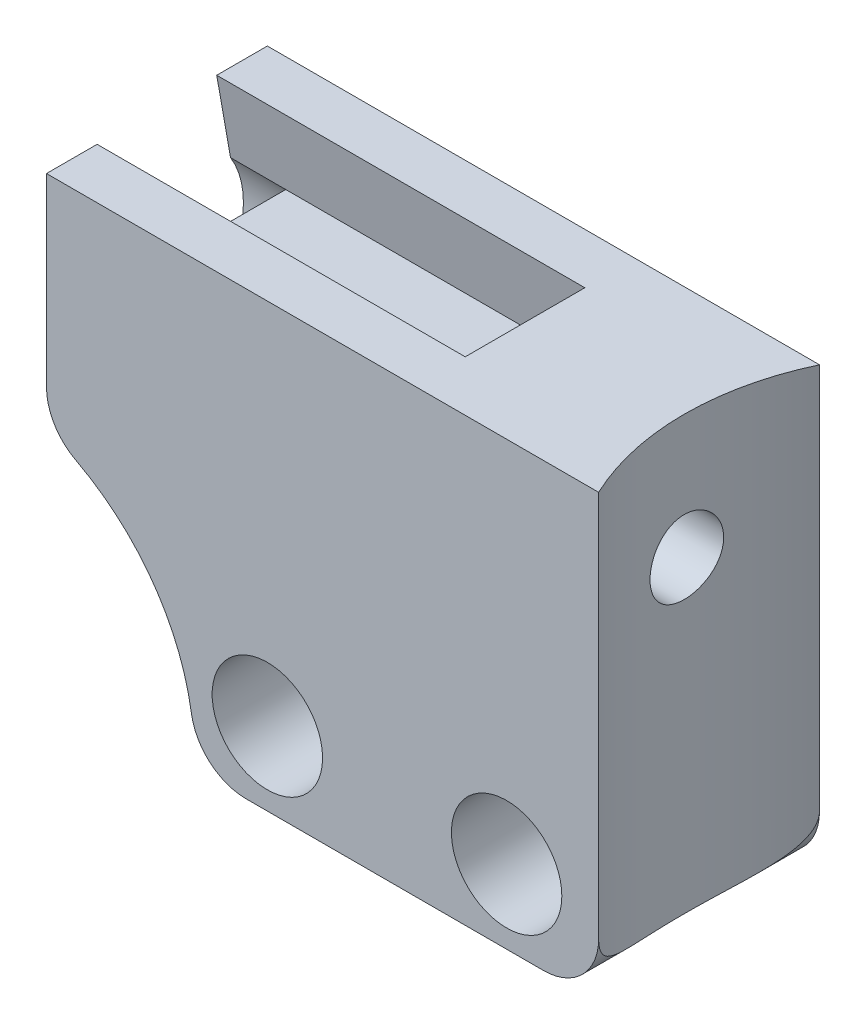
ISO-10303-21;
HEADER;
FILE_DESCRIPTION(('STEP AP214'),'2;1');
FILE_NAME('part.step','',(''),(''),'','','');
FILE_SCHEMA(('AUTOMOTIVE_DESIGN { 1 0 10303 214 1 1 1 1 }'));
ENDSEC;
DATA;
#1=APPLICATION_CONTEXT('core data for automotive mechanical design processes');
#2=APPLICATION_PROTOCOL_DEFINITION('international standard','automotive_design',2000,#1);
#3=PRODUCT_CONTEXT('',#1,'mechanical');
#4=PRODUCT('Part','Part','',(#3));
#5=PRODUCT_RELATED_PRODUCT_CATEGORY('part','',(#4));
#6=PRODUCT_DEFINITION_FORMATION('','',#4);
#7=PRODUCT_DEFINITION_CONTEXT('part definition',#1,'design');
#8=PRODUCT_DEFINITION('design','',#6,#7);
#9=PRODUCT_DEFINITION_SHAPE('','',#8);
#10=(LENGTH_UNIT() NAMED_UNIT(*) SI_UNIT(.MILLI.,.METRE.));
#11=(NAMED_UNIT(*) PLANE_ANGLE_UNIT() SI_UNIT($,.RADIAN.));
#12=(NAMED_UNIT(*) SI_UNIT($,.STERADIAN.) SOLID_ANGLE_UNIT());
#13=UNCERTAINTY_MEASURE_WITH_UNIT(LENGTH_MEASURE(1.E-05),#10,'distance_accuracy_value','');
#14=(GEOMETRIC_REPRESENTATION_CONTEXT(3) GLOBAL_UNCERTAINTY_ASSIGNED_CONTEXT((#13)) GLOBAL_UNIT_ASSIGNED_CONTEXT((#10,
#11,#12)) REPRESENTATION_CONTEXT('',''));
#15=CARTESIAN_POINT('',(0.,0.,0.));
#16=DIRECTION('',(0.,0.,1.));
#17=DIRECTION('',(1.,0.,0.));
#18=AXIS2_PLACEMENT_3D('',#15,#16,#17);
#19=CARTESIAN_POINT('',(0.,17.2787460994362,0.));
#20=DIRECTION('',(-1.,0.,0.));
#21=DIRECTION('',(0.,0.,1.));
#22=AXIS2_PLACEMENT_3D('',#19,#20,#21);
#23=CYLINDRICAL_SURFACE('',#22,2.);
#24=CARTESIAN_POINT('',(-27.,17.2787460994362,0.));
#25=DIRECTION('',(-1.,0.,0.));
#26=DIRECTION('',(0.,0.,1.));
#27=AXIS2_PLACEMENT_3D('',#24,#25,#26);
#28=CIRCLE('',#27,2.);
#29=CARTESIAN_POINT('',(-27.,17.2787460994362,2.));
#30=VERTEX_POINT('',#29);
#31=EDGE_CURVE('E231',#30,#30,#28,.T.);
#32=ORIENTED_EDGE('',*,*,#31,.T.);
#33=EDGE_LOOP('',(#32));
#34=FACE_BOUND('',#33,.T.);
#35=CARTESIAN_POINT('',(-1.2072958198775,17.2787460994362,2.));
#36=CARTESIAN_POINT('',(-1.20729761645299,17.3904702706759,1.99999534115949));
#37=CARTESIAN_POINT('',(-1.20866167905263,17.5022608122084,1.99060664506871));
#38=CARTESIAN_POINT('',(-1.21396735063322,17.7227207358595,1.95330740137887));
#39=CARTESIAN_POINT('',(-1.2179115281568,17.8313868949514,1.92537839621705));
#40=CARTESIAN_POINT('',(-1.22792178575887,18.0423747994651,1.85184738836467));
#41=CARTESIAN_POINT('',(-1.23398629440237,18.1447011775367,1.80625847122079));
#42=CARTESIAN_POINT('',(-1.24755202530755,18.3402358289043,1.69873175889211));
#43=CARTESIAN_POINT('',(-1.25505303527161,18.4334454464765,1.63679637900725));
#44=CARTESIAN_POINT('',(-1.270707611882,18.6087943952835,1.49785346840196));
#45=CARTESIAN_POINT('',(-1.27886510405378,18.6908578133021,1.42075056427329));
#46=CARTESIAN_POINT('',(-1.2948783905109,18.8409276566768,1.25386707896715));
#47=CARTESIAN_POINT('',(-1.30273416868212,18.9089333320765,1.16408582185113));
#48=CARTESIAN_POINT('',(-1.31729972955539,19.0292351971959,0.973910384020492));
#49=CARTESIAN_POINT('',(-1.32400438226122,19.0814618139546,0.873471766216092));
#50=CARTESIAN_POINT('',(-1.33546887385556,19.168276834764,0.665136745963096));
#51=CARTESIAN_POINT('',(-1.34022880616293,19.2028660860836,0.55724070203933));
#52=CARTESIAN_POINT('',(-1.34723985941628,19.2531953064005,0.337834063540951));
#53=CARTESIAN_POINT('',(-1.34950786250758,19.2690621694024,0.226353125069878));
#54=CARTESIAN_POINT('',(-1.35133731416478,19.2818899980028,0.00228956527839933));
#55=CARTESIAN_POINT('',(-1.3508988998488,19.2788519214023,-0.110292999940578));
#56=CARTESIAN_POINT('',(-1.34737845395911,19.2540567212204,-0.33249899218587));
#57=CARTESIAN_POINT('',(-1.34431570065077,19.2324361005537,-0.442137999771035));
#58=CARTESIAN_POINT('',(-1.33591221345283,19.171303539737,-0.656215595128694));
#59=CARTESIAN_POINT('',(-1.3305714254334,19.1317911744484,-0.760654059261884));
#60=CARTESIAN_POINT('',(-1.3181787630363,19.0358553546526,-0.961781966767738));
#61=CARTESIAN_POINT('',(-1.3111210410436,18.9793739483174,-1.05844339279107));
#62=CARTESIAN_POINT('',(-1.29608202628877,18.8511456066959,-1.24096782013765));
#63=CARTESIAN_POINT('',(-1.28810067832597,18.779397758793,-1.32683017541183));
#64=CARTESIAN_POINT('',(-1.27202140876451,18.6219114977602,-1.48612299106386));
#65=CARTESIAN_POINT('',(-1.26392308243878,18.536053966687,-1.55943569332184));
#66=CARTESIAN_POINT('',(-1.24859229808312,18.3531915780067,-1.69062989590123));
#67=CARTESIAN_POINT('',(-1.24135984448954,18.2561866632906,-1.74851131716179));
#68=CARTESIAN_POINT('',(-1.22857989615573,18.05366580953,-1.84721301520795));
#69=CARTESIAN_POINT('',(-1.22303351702515,17.9481442935536,-1.88802200251778));
#70=CARTESIAN_POINT('',(-1.21427401741597,17.7316485196103,-1.9513062370832));
#71=CARTESIAN_POINT('',(-1.21106074848775,17.6206746090446,-1.97378265080303));
#72=CARTESIAN_POINT('',(-1.20735916689967,17.3974695620062,-1.99960390688194));
#73=CARTESIAN_POINT('',(-1.20684713135755,17.2852580734406,-2.00311531104472));
#74=CARTESIAN_POINT('',(-1.20854308465363,17.061848294411,-1.99134808247121));
#75=CARTESIAN_POINT('',(-1.2107509971896,16.9506499756129,-1.9760699768337));
#76=CARTESIAN_POINT('',(-1.21761632457812,16.7329339194078,-1.92729837855202));
#77=CARTESIAN_POINT('',(-1.22226267277898,16.6263973723709,-1.89388715844421));
#78=CARTESIAN_POINT('',(-1.23347227144818,16.4204373019797,-1.80988306171463));
#79=CARTESIAN_POINT('',(-1.24003560842258,16.3210140998745,-1.75928940970141));
#80=CARTESIAN_POINT('',(-1.25439584346066,16.1313542197147,-1.64195360331226));
#81=CARTESIAN_POINT('',(-1.26220088384952,16.0411851382238,-1.57510320027125));
#82=CARTESIAN_POINT('',(-1.27814026798574,15.8732863758107,-1.42730277821365));
#83=CARTESIAN_POINT('',(-1.28627462855594,15.7955573313771,-1.34635203820217));
#84=CARTESIAN_POINT('',(-1.30202988346559,15.6541508810024,-1.17191708628535));
#85=CARTESIAN_POINT('',(-1.30964645494501,15.5905835771167,-1.07834317212433));
#86=CARTESIAN_POINT('',(-1.32344157492451,15.4800705363005,-0.881748704771195));
#87=CARTESIAN_POINT('',(-1.32962015973136,15.4331243796982,-0.778728390176455));
#88=CARTESIAN_POINT('',(-1.33982413777089,15.3573639851205,-0.566515924593931));
#89=CARTESIAN_POINT('',(-1.3438567958987,15.3284885108087,-0.457345999123928));
#90=CARTESIAN_POINT('',(-1.34934495049174,15.2894906323296,-0.235645259045785));
#91=CARTESIAN_POINT('',(-1.35080060067885,15.2793671095823,-0.123114645314278));
#92=CARTESIAN_POINT('',(-1.35096943604565,15.2781858604917,0.101043130627157));
#93=CARTESIAN_POINT('',(-1.34970690955043,15.2869592804178,0.212669421750584));
#94=CARTESIAN_POINT('',(-1.34463000207693,15.3229622494792,0.432842633479872));
#95=CARTESIAN_POINT('',(-1.34081562712352,15.3501917550401,0.541389561355443));
#96=CARTESIAN_POINT('',(-1.33106157986904,15.4222760768644,0.752283714497251));
#97=CARTESIAN_POINT('',(-1.32512318752313,15.4671202799209,0.854634630206984));
#98=CARTESIAN_POINT('',(-1.31177496034943,15.5731432486382,1.05038570585148));
#99=CARTESIAN_POINT('',(-1.30436508677029,15.6343224444943,1.14378562996655));
#100=CARTESIAN_POINT('',(-1.28881983396107,15.7718938146596,1.31984194960265));
#101=CARTESIAN_POINT('',(-1.28067881791678,15.8484110062687,1.40240016631985));
#102=CARTESIAN_POINT('',(-1.26463159358859,16.0142236596715,1.55356716727243));
#103=CARTESIAN_POINT('',(-1.25672544097715,16.1035221224327,1.6221726663073));
#104=CARTESIAN_POINT('',(-1.24200023784384,16.2928915377718,1.74379523475593));
#105=CARTESIAN_POINT('',(-1.23518689959913,16.3930147898473,1.79673154300995));
#106=CARTESIAN_POINT('',(-1.22348564068595,16.6007783960407,1.88495902507096));
#107=CARTESIAN_POINT('',(-1.21859569370808,16.7084106977534,1.92026877922144));
#108=CARTESIAN_POINT('',(-1.21244228150373,16.8935825252667,1.96409255165575));
#109=CARTESIAN_POINT('',(-1.21052239922045,16.9699704348468,1.97753762529532));
#110=CARTESIAN_POINT('',(-1.20794855248953,17.123810296402,1.99549291508544));
#111=CARTESIAN_POINT('',(-1.20729457390174,17.2012622364823,2.00000323103726));
#112=CARTESIAN_POINT('',(-1.2072958198775,17.2787460994362,2.));
#113=B_SPLINE_CURVE_WITH_KNOTS('',3,(#35,#36,#37,#38,#39,#40,#41,#42,#43,#44,#45,#46,#47,#48,
#49,#50,#51,#52,#53,#54,#55,#56,#57,#58,#59,#60,#61,#62,#63,#64,#65,#66,#67,#68,#69,#70,#71,#72,
#73,#74,#75,#76,#77,#78,#79,#80,#81,#82,#83,#84,#85,#86,#87,#88,#89,#90,#91,#92,#93,#94,#95,#96,
#97,#98,#99,#100,#101,#102,#103,#104,#105,#106,#107,#108,#109,#110,#111,#112),.UNSPECIFIED.,.T.,
.F.,(4,2,2,2,2,2,2,2,2,2,2,2,2,2,2,2,2,2,2,2,2,2,2,2,2,2,2,2,2,2,2,2,2,2,2,2,2,2,4),(0.,
0.334889349408971,0.670112594526281,1.00508792139358,1.34001378108308,1.6771171564902,
2.01423851114537,2.35282530676003,2.6913958357102,3.02765822138618,3.36390357078099,
3.69769984907442,4.03150405935711,4.36646147641387,4.70143892261039,5.03940517986243,
5.37737316862278,5.7155642933107,6.05373389790876,6.3889286108256,6.72411392079906,
7.05779100804298,7.39148315513125,7.72746121011463,8.06345644976601,8.40197921522166,
8.74049343261658,9.07785422138908,9.41519488547502,9.74953375304066,10.083871831239,
10.4180087723112,10.7521545140199,11.0891434930866,11.426211725383,11.7649881551453,
12.103406718889,12.3356645196522,12.5679197260806),.UNSPECIFIED.);
#114=CARTESIAN_POINT('',(-1.2072958198775,17.2787460994362,2.));
#115=VERTEX_POINT('',#114);
#116=EDGE_CURVE('E11',#115,#115,#113,.T.);
#117=ORIENTED_EDGE('',*,*,#116,.F.);
#118=EDGE_LOOP('',(#117));
#119=FACE_BOUND('',#118,.T.);
#120=ADVANCED_FACE('F39',(#34,#119),#23,.F.);
#121=CARTESIAN_POINT('',(-3.,3.,6.));
#122=DIRECTION('',(0.,0.,-1.));
#123=DIRECTION('',(-1.,0.,0.));
#124=AXIS2_PLACEMENT_3D('',#121,#122,#123);
#125=CYLINDRICAL_SURFACE('',#124,3.);
#126=CARTESIAN_POINT('',(0.,3.00000000000002,6.));
#127=CARTESIAN_POINT('',(4.32430555138922E-06,2.96131368489774,6.00000657782793));
#128=CARTESIAN_POINT('',(-0.000749031100675108,2.92264899494266,5.99842111634692));
#129=CARTESIAN_POINT('',(-0.0037260574453061,2.84565930508018,5.99214002263668));
#130=CARTESIAN_POINT('',(-0.00594859289457837,2.80733406598386,5.98744679231227));
#131=CARTESIAN_POINT('',(-0.0147008526854425,2.693914349222,5.96892549487739));
#132=CARTESIAN_POINT('',(-0.0233170042580858,2.61966237154087,5.95065279558791));
#133=CARTESIAN_POINT('',(-0.0452820682135443,2.47563715247697,5.90364706701084));
#134=CARTESIAN_POINT('',(-0.0586177805220394,2.40585205412109,5.87494320654241));
#135=CARTESIAN_POINT('',(-0.0890162554926041,2.27134310085746,5.80873973995464));
#136=CARTESIAN_POINT('',(-0.106087182101755,2.20663076086176,5.77122085363036));
#137=CARTESIAN_POINT('',(-0.154537743288445,2.04372826287639,5.66320698550602));
#138=CARTESIAN_POINT('',(-0.18815841559093,1.95011803825462,5.5868243336825));
#139=CARTESIAN_POINT('',(-0.259053506025177,1.77687848894329,5.42102147661569));
#140=CARTESIAN_POINT('',(-0.296337626344393,1.69728793804925,5.33156632801316));
#141=CARTESIAN_POINT('',(-0.366465210257066,1.56145571106221,5.15773522555035));
#142=CARTESIAN_POINT('',(-0.399138435334249,1.50350230201722,5.07460188449947));
#143=CARTESIAN_POINT('',(-0.464442005502469,1.39533757301824,4.90338040950719));
#144=CARTESIAN_POINT('',(-0.497072301168255,1.34513199696211,4.81528866502641));
#145=CARTESIAN_POINT('',(-0.561628899007836,1.25140415380009,4.63524768619274));
#146=CARTESIAN_POINT('',(-0.593554239616493,1.20789058404651,4.54329362635494));
#147=CARTESIAN_POINT('',(-0.656199869419031,1.12670848703533,4.35642562129567));
#148=CARTESIAN_POINT('',(-0.68691969647518,1.08904218530366,4.26151056551709));
#149=CARTESIAN_POINT('',(-0.775065294975482,0.985607331687847,3.9786527517509));
#150=CARTESIAN_POINT('',(-0.830333168952659,0.926866108740439,3.78745414397993));
#151=CARTESIAN_POINT('',(-0.933457830445835,0.824071261672477,3.39916477809136));
#152=CARTESIAN_POINT('',(-0.981307857275283,0.780030994459434,3.20206883798122));
#153=CARTESIAN_POINT('',(-1.06887907647508,0.703446368339828,2.80330945357193));
#154=CARTESIAN_POINT('',(-1.10857689216874,0.670934879975621,2.60163466634058));
#155=CARTESIAN_POINT('',(-1.17919548015236,0.615322865282577,2.1955472288429));
#156=CARTESIAN_POINT('',(-1.21011829250655,0.592220151002376,1.99113522653184));
#157=CARTESIAN_POINT('',(-1.25699210887975,0.55816628486571,1.62667082591958));
#158=CARTESIAN_POINT('',(-1.27474638167423,0.545650474506108,1.46698945687384));
#159=CARTESIAN_POINT('',(-1.30476508592709,0.524820318694511,1.14682323303154));
#160=CARTESIAN_POINT('',(-1.31702901807122,0.516506355366982,0.98633830649766));
#161=CARTESIAN_POINT('',(-1.3360237678297,0.503740202455899,0.664806153248079));
#162=CARTESIAN_POINT('',(-1.34275166479734,0.49929005123594,0.503758674680108));
#163=CARTESIAN_POINT('',(-1.35064171555358,0.494079079276011,0.181448324229977));
#164=CARTESIAN_POINT('',(-1.35180318143513,0.493318714524674,0.0201854281893537));
#165=CARTESIAN_POINT('',(-1.34855806845258,0.495455475463019,-0.301923523702598));
#166=CARTESIAN_POINT('',(-1.34416310815365,0.498344969236051,-0.462769746964203));
#167=CARTESIAN_POINT('',(-1.32984029761783,0.507884245524259,-0.78408471685415));
#168=CARTESIAN_POINT('',(-1.31991315912952,0.514533544319118,-0.944553509374802));
#169=CARTESIAN_POINT('',(-1.29456874264492,0.531854924065808,-1.26474525286659));
#170=CARTESIAN_POINT('',(-1.2791547362238,0.542524608062317,-1.42446859094746));
#171=CARTESIAN_POINT('',(-1.24289810046695,0.56831559402253,-1.74291960729583));
#172=CARTESIAN_POINT('',(-1.22205622253359,0.583436279853637,-1.9016474202657));
#173=CARTESIAN_POINT('',(-1.1760785316468,0.617963045019097,-2.21076212662484));
#174=CARTESIAN_POINT('',(-1.15117325373501,0.637150146141172,-2.36120756792393));
#175=CARTESIAN_POINT('',(-1.09661964349946,0.680869305178738,-2.66045578936483));
#176=CARTESIAN_POINT('',(-1.06697154747429,0.705401096830934,-2.80925865094928));
#177=CARTESIAN_POINT('',(-1.00311271873966,0.760752594701999,-3.10477985577465));
#178=CARTESIAN_POINT('',(-0.968900097953761,0.79157490575001,-3.25149730846452));
#179=CARTESIAN_POINT('',(-0.896220338278186,0.86069338747074,-3.54209281323172));
#180=CARTESIAN_POINT('',(-0.857754008451359,0.898988137928269,-3.68597139915252));
#181=CARTESIAN_POINT('',(-0.785746779046453,0.975350788889707,-3.93929073729185));
#182=CARTESIAN_POINT('',(-0.752935341083431,1.01168286609796,-4.04946041583884));
#183=CARTESIAN_POINT('',(-0.685326182564192,1.09081253821947,-4.2668180322021));
#184=CARTESIAN_POINT('',(-0.65052902549519,1.13360830455323,-4.37400680319485));
#185=CARTESIAN_POINT('',(-0.57951746805598,1.22667418526092,-4.58428594516791));
#186=CARTESIAN_POINT('',(-0.543306872324327,1.27692513356048,-4.68738599069193));
#187=CARTESIAN_POINT('',(-0.470132474833751,1.38627807038578,-4.88844373873728));
#188=CARTESIAN_POINT('',(-0.433169355593388,1.44537232242621,-4.98640583597532));
#189=CARTESIAN_POINT('',(-0.360586282056609,1.572175030529,-5.17276484627332));
#190=CARTESIAN_POINT('',(-0.324957931917135,1.63959217984807,-5.2613540633039));
#191=CARTESIAN_POINT('',(-0.255487094573217,1.78583525499626,-5.42951260634079));
#192=CARTESIAN_POINT('',(-0.221643860683014,1.86465635825711,-5.50908571988987));
#193=CARTESIAN_POINT('',(-0.162998639046298,2.02158741514103,-5.64397027703847));
#194=CARTESIAN_POINT('',(-0.13761123533588,2.09786831719648,-5.70112946958125));
#195=CARTESIAN_POINT('',(-0.0915959838611257,2.25958768213681,-5.80323466559771));
#196=CARTESIAN_POINT('',(-0.0709613843251925,2.34501289868122,-5.84819801067441));
#197=CARTESIAN_POINT('',(-0.0403961469725055,2.50421209121193,-5.91417327061582));
#198=CARTESIAN_POINT('',(-0.0291110335927961,2.57644116701487,-5.93827396964489));
#199=CARTESIAN_POINT('',(-0.0117769209315302,2.72428505877453,-5.97514464420929));
#200=CARTESIAN_POINT('',(-0.00571510232229286,2.79989110381275,-5.98794236215029));
#201=CARTESIAN_POINT('',(-0.00170866627508038,2.89665171887143,-5.99639650256274));
#202=CARTESIAN_POINT('',(-0.00106838999469525,2.91729951215707,-5.99774710398821));
#203=CARTESIAN_POINT('',(-0.000214560141068557,2.958628897362,-5.99954782677548));
#204=CARTESIAN_POINT('',(-7.13128067505531E-07,2.97931045623128,-5.99999856736084));
#205=CARTESIAN_POINT('',(0.,2.99999999999996,-6.00000000000067));
#206=B_SPLINE_CURVE_WITH_KNOTS('',3,(#126,#127,#128,#129,#130,#131,#132,#133,#134,#135,#136,
#137,#138,#139,#140,#141,#142,#143,#144,#145,#146,#147,#148,#149,#150,#151,#152,#153,#154,#155,
#156,#157,#158,#159,#160,#161,#162,#163,#164,#165,#166,#167,#168,#169,#170,#171,#172,#173,#174,
#175,#176,#177,#178,#179,#180,#181,#182,#183,#184,#185,#186,#187,#188,#189,#190,#191,#192,#193,
#194,#195,#196,#197,#198,#199,#200,#201,#202,#203,#204,#205),.UNSPECIFIED.,.F.,.F.,(4,2,2,2,2,2,
2,2,2,2,2,2,2,2,2,2,2,2,2,2,2,2,2,2,2,2,2,2,2,2,2,2,2,2,2,2,2,2,2,4),(0.,0.115978440825648,
0.23186734971932,0.461534914863905,0.690565137462779,0.920101036004706,1.29418067542735,
1.66927918438642,1.98825534975723,2.30746686542738,2.62708980488812,2.94683409918986,
3.5683430669535,4.19041519435523,4.81424696004488,5.4379335746249,5.9212438006754,
6.40459797202966,6.8882069833997,7.3718757582815,7.85453484564129,8.33713185028627,
8.81944158448488,9.30168458604014,9.76261043610152,10.2235133288779,10.6846074647029,
11.1456140499788,11.5070956943804,11.8684752664076,12.2289413919191,12.5890939907266,
12.9390483454712,13.2888551397755,13.583773698603,13.8782706798592,14.1082791886236,
14.3377215754368,14.3998110483178,14.4618577806615),.UNSPECIFIED.);
#207=CARTESIAN_POINT('',(0.,3.00000000000002,6.));
#208=VERTEX_POINT('',#207);
#209=CARTESIAN_POINT('',(0.,3.00000000000002,-6.00000000000001));
#210=VERTEX_POINT('',#209);
#211=EDGE_CURVE('E43',#208,#210,#206,.T.);
#212=ORIENTED_EDGE('',*,*,#211,.F.);
#213=CARTESIAN_POINT('',(-3.,3.,6.));
#214=DIRECTION('',(0.,0.,1.));
#215=DIRECTION('',(1.,0.,0.));
#216=AXIS2_PLACEMENT_3D('',#213,#214,#215);
#217=CIRCLE('',#216,3.);
#218=CARTESIAN_POINT('',(-3.00000000000002,0.,6.));
#219=VERTEX_POINT('',#218);
#220=EDGE_CURVE('E131',#219,#208,#217,.T.);
#221=ORIENTED_EDGE('',*,*,#220,.F.);
#222=DIRECTION('',(0.,0.,-1.));
#223=VECTOR('',#222,1.);
#224=CARTESIAN_POINT('',(-3.00000000000002,0.,6.));
#225=LINE('',#224,#223);
#226=CARTESIAN_POINT('',(-3.00000000000002,0.,-6.));
#227=VERTEX_POINT('',#226);
#228=EDGE_CURVE('E139',#219,#227,#225,.T.);
#229=ORIENTED_EDGE('',*,*,#228,.T.);
#230=CARTESIAN_POINT('',(-3.,3.,-6.));
#231=DIRECTION('',(0.,0.,1.));
#232=DIRECTION('',(1.,0.,0.));
#233=AXIS2_PLACEMENT_3D('',#230,#231,#232);
#234=CIRCLE('',#233,3.);
#235=EDGE_CURVE('E167',#227,#210,#234,.T.);
#236=ORIENTED_EDGE('',*,*,#235,.T.);
#237=EDGE_LOOP('',(#212,#221,#229,#236));
#238=FACE_BOUND('',#237,.T.);
#239=ADVANCED_FACE('F148',(#238),#125,.T.);
#240=CARTESIAN_POINT('',(-30.,24.,6.));
#241=DIRECTION('',(1.,0.,0.));
#242=DIRECTION('',(0.,0.,-1.));
#243=AXIS2_PLACEMENT_3D('',#240,#241,#242);
#244=PLANE('',#243);
#245=DIRECTION('',(0.,-0.984807753012208,0.173648177666934));
#246=VECTOR('',#245,1.);
#247=CARTESIAN_POINT('',(-30.,1.27947128347335,7.25624222868521));
#248=LINE('',#247,#246);
#249=CARTESIAN_POINT('',(-30.,24.,3.25));
#250=VERTEX_POINT('',#249);
#251=CARTESIAN_POINT('',(-30.,19.7465386352868,4.));
#252=VERTEX_POINT('',#251);
#253=EDGE_CURVE('E259',#250,#252,#248,.T.);
#254=ORIENTED_EDGE('',*,*,#253,.T.);
#255=CARTESIAN_POINT('',(-30.,17.2787460994362,0.));
#256=DIRECTION('',(-1.,0.,0.));
#257=DIRECTION('',(0.,0.,1.));
#258=AXIS2_PLACEMENT_3D('',#255,#256,#257);
#259=CIRCLE('',#258,4.7);
#260=CARTESIAN_POINT('',(-30.,13.9561431810345,3.32420063272788));
#261=VERTEX_POINT('',#260);
#262=EDGE_CURVE('E61',#261,#252,#259,.T.);
#263=ORIENTED_EDGE('',*,*,#262,.F.);
#264=DIRECTION('',(0.,0.,-1.));
#265=VECTOR('',#264,1.);
#266=CARTESIAN_POINT('',(-30.,13.9561431810345,6.));
#267=LINE('',#266,#265);
#268=CARTESIAN_POINT('',(-30.,13.9561431810345,6.));
#269=VERTEX_POINT('',#268);
#270=EDGE_CURVE('E181',#269,#261,#267,.T.);
#271=ORIENTED_EDGE('',*,*,#270,.F.);
#272=DIRECTION('',(0.,-1.,0.));
#273=VECTOR('',#272,1.);
#274=CARTESIAN_POINT('',(-30.,24.,6.));
#275=LINE('',#274,#273);
#276=CARTESIAN_POINT('',(-30.,24.,6.));
#277=VERTEX_POINT('',#276);
#278=EDGE_CURVE('E110',#277,#269,#275,.T.);
#279=ORIENTED_EDGE('',*,*,#278,.F.);
#280=DIRECTION('',(0.,0.,-1.));
#281=VECTOR('',#280,1.);
#282=CARTESIAN_POINT('',(-30.,24.,6.));
#283=LINE('',#282,#281);
#284=EDGE_CURVE('E184',#277,#250,#283,.T.);
#285=ORIENTED_EDGE('',*,*,#284,.T.);
#286=EDGE_LOOP('',(#254,#263,#271,#279,#285));
#287=FACE_BOUND('',#286,.T.);
#288=ADVANCED_FACE('F210',(#287),#244,.F.);
#289=CARTESIAN_POINT('',(-10.,19.7465386352868,0.));
#290=DIRECTION('',(0.,1.,0.));
#291=DIRECTION('',(0.,0.,1.));
#292=AXIS2_PLACEMENT_3D('',#289,#290,#291);
#293=PLANE('',#292);
#294=DIRECTION('',(-1.,0.,0.));
#295=VECTOR('',#294,1.);
#296=CARTESIAN_POINT('',(-10.,19.7465386352868,-4.));
#297=LINE('',#296,#295);
#298=CARTESIAN_POINT('',(-10.,19.7465386352868,-4.));
#299=VERTEX_POINT('',#298);
#300=CARTESIAN_POINT('',(-27.,19.7465386352868,-4.));
#301=VERTEX_POINT('',#300);
#302=EDGE_CURVE('E348',#299,#301,#297,.T.);
#303=ORIENTED_EDGE('',*,*,#302,.T.);
#304=DIRECTION('',(0.,0.,-1.));
#305=VECTOR('',#304,1.);
#306=CARTESIAN_POINT('',(-27.,19.7465386352868,0.));
#307=LINE('',#306,#305);
#308=CARTESIAN_POINT('',(-27.,19.7465386352868,4.));
#309=VERTEX_POINT('',#308);
#310=EDGE_CURVE('E325',#309,#301,#307,.T.);
#311=ORIENTED_EDGE('',*,*,#310,.F.);
#312=DIRECTION('',(-1.,0.,0.));
#313=VECTOR('',#312,1.);
#314=CARTESIAN_POINT('',(-10.,19.7465386352868,4.));
#315=LINE('',#314,#313);
#316=CARTESIAN_POINT('',(-10.,19.7465386352868,4.));
#317=VERTEX_POINT('',#316);
#318=EDGE_CURVE('E345',#317,#309,#315,.T.);
#319=ORIENTED_EDGE('',*,*,#318,.F.);
#320=DIRECTION('',(0.,0.,-1.));
#321=VECTOR('',#320,1.);
#322=CARTESIAN_POINT('',(-10.,19.7465386352868,0.));
#323=LINE('',#322,#321);
#324=EDGE_CURVE('E263',#317,#299,#323,.T.);
#325=ORIENTED_EDGE('',*,*,#324,.T.);
#326=EDGE_LOOP('',(#303,#311,#319,#325));
#327=FACE_BOUND('',#326,.T.);
#328=ADVANCED_FACE('F205',(#327),#293,.T.);
#329=CARTESIAN_POINT('',(0.,24.,6.));
#330=DIRECTION('',(0.,-1.,0.));
#331=DIRECTION('',(0.,0.,-1.));
#332=AXIS2_PLACEMENT_3D('',#329,#330,#331);
#333=PLANE('',#332);
#334=CARTESIAN_POINT('',(12.6491106406735,24.,0.));
#335=DIRECTION('',(0.,-1.,0.));
#336=DIRECTION('',(0.,0.,-1.));
#337=AXIS2_PLACEMENT_3D('',#334,#335,#336);
#338=CIRCLE('',#337,14.);
#339=CARTESIAN_POINT('',(0.,24.,-6.));
#340=VERTEX_POINT('',#339);
#341=CARTESIAN_POINT('',(0.,24.,6.));
#342=VERTEX_POINT('',#341);
#343=EDGE_CURVE('E101',#340,#342,#338,.F.);
#344=ORIENTED_EDGE('',*,*,#343,.F.);
#345=DIRECTION('',(-1.,0.,0.));
#346=VECTOR('',#345,1.);
#347=CARTESIAN_POINT('',(0.,24.,-6.));
#348=LINE('',#347,#346);
#349=CARTESIAN_POINT('',(-30.,24.,-6.));
#350=VERTEX_POINT('',#349);
#351=EDGE_CURVE('E154',#340,#350,#348,.T.);
#352=ORIENTED_EDGE('',*,*,#351,.T.);
#353=CARTESIAN_POINT('',(-30.,24.,-3.25));
#354=VERTEX_POINT('',#353);
#355=EDGE_CURVE('E183',#354,#350,#283,.T.);
#356=ORIENTED_EDGE('',*,*,#355,.F.);
#357=DIRECTION('',(-1.,0.,0.));
#358=VECTOR('',#357,1.);
#359=CARTESIAN_POINT('',(-10.,24.,-3.25));
#360=LINE('',#359,#358);
#361=CARTESIAN_POINT('',(-10.,24.,-3.25));
#362=VERTEX_POINT('',#361);
#363=EDGE_CURVE('E358',#362,#354,#360,.T.);
#364=ORIENTED_EDGE('',*,*,#363,.F.);
#365=DIRECTION('',(0.,0.,-1.));
#366=VECTOR('',#365,1.);
#367=CARTESIAN_POINT('',(-10.,24.,0.));
#368=LINE('',#367,#366);
#369=CARTESIAN_POINT('',(-10.,24.,3.25));
#370=VERTEX_POINT('',#369);
#371=EDGE_CURVE('E361',#370,#362,#368,.T.);
#372=ORIENTED_EDGE('',*,*,#371,.F.);
#373=DIRECTION('',(-1.,0.,0.));
#374=VECTOR('',#373,1.);
#375=CARTESIAN_POINT('',(-10.,24.,3.25));
#376=LINE('',#375,#374);
#377=EDGE_CURVE('E354',#370,#250,#376,.T.);
#378=ORIENTED_EDGE('',*,*,#377,.T.);
#379=ORIENTED_EDGE('',*,*,#284,.F.);
#380=DIRECTION('',(-1.,0.,0.));
#381=VECTOR('',#380,1.);
#382=CARTESIAN_POINT('',(0.,24.,6.));
#383=LINE('',#382,#381);
#384=EDGE_CURVE('E171',#342,#277,#383,.T.);
#385=ORIENTED_EDGE('',*,*,#384,.F.);
#386=EDGE_LOOP('',(#344,#352,#356,#364,#372,#378,#379,#385));
#387=FACE_BOUND('',#386,.T.);
#388=ADVANCED_FACE('F41',(#387),#333,.F.);
#389=CARTESIAN_POINT('',(-30.,13.9561431810345,-3.32420063272788));
#390=VERTEX_POINT('',#389);
#391=CARTESIAN_POINT('',(-30.,13.9561431810345,-6.));
#392=VERTEX_POINT('',#391);
#393=EDGE_CURVE('E180',#390,#392,#267,.T.);
#394=ORIENTED_EDGE('',*,*,#393,.F.);
#395=CARTESIAN_POINT('',(-30.,19.7465386352868,-4.));
#396=VERTEX_POINT('',#395);
#397=EDGE_CURVE('E321',#396,#390,#259,.T.);
#398=ORIENTED_EDGE('',*,*,#397,.F.);
#399=DIRECTION('',(0.,0.984807753012208,0.173648177666934));
#400=VECTOR('',#399,1.);
#401=CARTESIAN_POINT('',(-30.,1.27947128347335,-7.25624222868521));
#402=LINE('',#401,#400);
#403=EDGE_CURVE('E197',#396,#354,#402,.T.);
#404=ORIENTED_EDGE('',*,*,#403,.T.);
#405=ORIENTED_EDGE('',*,*,#355,.T.);
#406=DIRECTION('',(0.,-1.,0.));
#407=VECTOR('',#406,1.);
#408=CARTESIAN_POINT('',(-30.,24.,-6.));
#409=LINE('',#408,#407);
#410=EDGE_CURVE('E156',#350,#392,#409,.T.);
#411=ORIENTED_EDGE('',*,*,#410,.T.);
#412=EDGE_LOOP('',(#394,#398,#404,#405,#411));
#413=FACE_BOUND('',#412,.T.);
#414=ADVANCED_FACE('F193',(#413),#244,.F.);
#415=CARTESIAN_POINT('',(-27.,13.9561431810345,6.));
#416=DIRECTION('',(0.,0.,1.));
#417=DIRECTION('',(1.,0.,0.));
#418=AXIS2_PLACEMENT_3D('',#415,#416,#417);
#419=PLANE('',#418);
#420=CARTESIAN_POINT('',(-18.,4.,6.));
#421=DIRECTION('',(0.,0.,1.));
#422=DIRECTION('',(1.,0.,0.));
#423=AXIS2_PLACEMENT_3D('',#420,#421,#422);
#424=CIRCLE('',#423,3.);
#425=CARTESIAN_POINT('',(-15.,4.,6.));
#426=VERTEX_POINT('',#425);
#427=EDGE_CURVE('E157',#426,#426,#424,.T.);
#428=ORIENTED_EDGE('',*,*,#427,.F.);
#429=EDGE_LOOP('',(#428));
#430=FACE_BOUND('',#429,.T.);
#431=ORIENTED_EDGE('',*,*,#384,.T.);
#432=ORIENTED_EDGE('',*,*,#278,.T.);
#433=CARTESIAN_POINT('',(-27.,13.9561431810345,6.));
#434=DIRECTION('',(0.,0.,1.));
#435=DIRECTION('',(1.,0.,0.));
#436=AXIS2_PLACEMENT_3D('',#433,#434,#435);
#437=CIRCLE('',#436,3.);
#438=CARTESIAN_POINT('',(-28.3961492122268,11.3008150700097,6.));
#439=VERTEX_POINT('',#438);
#440=EDGE_CURVE('E309',#269,#439,#437,.T.);
#441=ORIENTED_EDGE('',*,*,#440,.T.);
#442=CARTESIAN_POINT('',(-33.9807460611341,0.67950262591059,6.));
#443=DIRECTION('',(0.,0.,-1.));
#444=DIRECTION('',(-1.,0.,0.));
#445=AXIS2_PLACEMENT_3D('',#442,#443,#444);
#446=CIRCLE('',#445,12.);
#447=CARTESIAN_POINT('',(-22.1252078262171,2.53590052518212,6.));
#448=VERTEX_POINT('',#447);
#449=EDGE_CURVE('E311',#439,#448,#446,.T.);
#450=ORIENTED_EDGE('',*,*,#449,.T.);
#451=CARTESIAN_POINT('',(-19.1613232674878,3.,6.));
#452=DIRECTION('',(0.,0.,1.));
#453=DIRECTION('',(-1.,0.,0.));
#454=AXIS2_PLACEMENT_3D('',#451,#452,#453);
#455=CIRCLE('',#454,3.);
#456=CARTESIAN_POINT('',(-19.1613232674878,0.,6.));
#457=VERTEX_POINT('',#456);
#458=EDGE_CURVE('E133',#448,#457,#455,.T.);
#459=ORIENTED_EDGE('',*,*,#458,.T.);
#460=DIRECTION('',(1.,0.,0.));
#461=VECTOR('',#460,1.);
#462=CARTESIAN_POINT('',(-19.1613232674878,0.,6.));
#463=LINE('',#462,#461);
#464=EDGE_CURVE('E126',#457,#219,#463,.T.);
#465=ORIENTED_EDGE('',*,*,#464,.T.);
#466=ORIENTED_EDGE('',*,*,#220,.T.);
#467=DIRECTION('',(0.,1.,0.));
#468=VECTOR('',#467,1.);
#469=CARTESIAN_POINT('',(0.,3.00000000000002,6.));
#470=LINE('',#469,#468);
#471=EDGE_CURVE('E70',#208,#342,#470,.T.);
#472=ORIENTED_EDGE('',*,*,#471,.T.);
#473=EDGE_LOOP('',(#431,#432,#441,#450,#459,#465,#466,#472));
#474=FACE_BOUND('',#473,.T.);
#475=CARTESIAN_POINT('',(-5.,4.,6.));
#476=DIRECTION('',(0.,0.,1.));
#477=DIRECTION('',(1.,0.,0.));
#478=AXIS2_PLACEMENT_3D('',#475,#476,#477);
#479=CIRCLE('',#478,3.);
#480=CARTESIAN_POINT('',(-2.,4.,6.));
#481=VERTEX_POINT('',#480);
#482=EDGE_CURVE('E299',#481,#481,#479,.T.);
#483=ORIENTED_EDGE('',*,*,#482,.F.);
#484=EDGE_LOOP('',(#483));
#485=FACE_BOUND('',#484,.T.);
#486=ADVANCED_FACE('F128',(#430,#474,#485),#419,.T.);
#487=CARTESIAN_POINT('',(-27.,13.9561431810345,-6.));
#488=DIRECTION('',(0.,0.,1.));
#489=DIRECTION('',(1.,0.,0.));
#490=AXIS2_PLACEMENT_3D('',#487,#488,#489);
#491=PLANE('',#490);
#492=ORIENTED_EDGE('',*,*,#351,.F.);
#493=DIRECTION('',(0.,1.,0.));
#494=VECTOR('',#493,1.);
#495=CARTESIAN_POINT('',(0.,3.00000000000002,-6.));
#496=LINE('',#495,#494);
#497=EDGE_CURVE('E169',#210,#340,#496,.T.);
#498=ORIENTED_EDGE('',*,*,#497,.F.);
#499=ORIENTED_EDGE('',*,*,#235,.F.);
#500=DIRECTION('',(1.,0.,0.));
#501=VECTOR('',#500,1.);
#502=CARTESIAN_POINT('',(-19.1613232674878,0.,-6.));
#503=LINE('',#502,#501);
#504=CARTESIAN_POINT('',(-19.1613232674878,0.,-6.));
#505=VERTEX_POINT('',#504);
#506=EDGE_CURVE('E142',#505,#227,#503,.T.);
#507=ORIENTED_EDGE('',*,*,#506,.F.);
#508=CARTESIAN_POINT('',(-19.1613232674878,3.,-6.));
#509=DIRECTION('',(0.,0.,1.));
#510=DIRECTION('',(-1.,0.,0.));
#511=AXIS2_PLACEMENT_3D('',#508,#509,#510);
#512=CIRCLE('',#511,3.);
#513=CARTESIAN_POINT('',(-22.1252078262171,2.53590052518212,-6.));
#514=VERTEX_POINT('',#513);
#515=EDGE_CURVE('E164',#514,#505,#512,.T.);
#516=ORIENTED_EDGE('',*,*,#515,.F.);
#517=CARTESIAN_POINT('',(-33.9807460611341,0.67950262591059,-6.));
#518=DIRECTION('',(0.,0.,-1.));
#519=DIRECTION('',(-1.,0.,0.));
#520=AXIS2_PLACEMENT_3D('',#517,#518,#519);
#521=CIRCLE('',#520,12.);
#522=CARTESIAN_POINT('',(-28.3961492122268,11.3008150700097,-6.));
#523=VERTEX_POINT('',#522);
#524=EDGE_CURVE('E162',#523,#514,#521,.T.);
#525=ORIENTED_EDGE('',*,*,#524,.F.);
#526=CARTESIAN_POINT('',(-27.,13.9561431810345,-6.));
#527=DIRECTION('',(0.,0.,1.));
#528=DIRECTION('',(1.,0.,0.));
#529=AXIS2_PLACEMENT_3D('',#526,#527,#528);
#530=CIRCLE('',#529,3.);
#531=EDGE_CURVE('E160',#392,#523,#530,.T.);
#532=ORIENTED_EDGE('',*,*,#531,.F.);
#533=ORIENTED_EDGE('',*,*,#410,.F.);
#534=EDGE_LOOP('',(#492,#498,#499,#507,#516,#525,#532,#533));
#535=FACE_BOUND('',#534,.T.);
#536=CARTESIAN_POINT('',(-18.,4.,-6.));
#537=DIRECTION('',(0.,0.,1.));
#538=DIRECTION('',(1.,0.,0.));
#539=AXIS2_PLACEMENT_3D('',#536,#537,#538);
#540=CIRCLE('',#539,3.);
#541=CARTESIAN_POINT('',(-15.,4.,-6.));
#542=VERTEX_POINT('',#541);
#543=EDGE_CURVE('E298',#542,#542,#540,.T.);
#544=ORIENTED_EDGE('',*,*,#543,.T.);
#545=EDGE_LOOP('',(#544));
#546=FACE_BOUND('',#545,.T.);
#547=CARTESIAN_POINT('',(-5.,4.,-6.));
#548=DIRECTION('',(0.,0.,1.));
#549=DIRECTION('',(1.,0.,0.));
#550=AXIS2_PLACEMENT_3D('',#547,#548,#549);
#551=CIRCLE('',#550,3.);
#552=CARTESIAN_POINT('',(-2.,4.,-6.));
#553=VERTEX_POINT('',#552);
#554=EDGE_CURVE('E303',#553,#553,#551,.T.);
#555=ORIENTED_EDGE('',*,*,#554,.T.);
#556=EDGE_LOOP('',(#555));
#557=FACE_BOUND('',#556,.T.);
#558=ADVANCED_FACE('F200',(#535,#546,#557),#491,.F.);
#559=CARTESIAN_POINT('',(-27.,13.9561431810345,6.));
#560=DIRECTION('',(0.,0.,-1.));
#561=DIRECTION('',(-1.,0.,0.));
#562=AXIS2_PLACEMENT_3D('',#559,#560,#561);
#563=CYLINDRICAL_SURFACE('',#562,3.);
#564=ORIENTED_EDGE('',*,*,#270,.T.);
#565=CARTESIAN_POINT('',(-30.,13.9561431810345,3.32420063272788));
#566=CARTESIAN_POINT('',(-29.9999853492437,13.8655461124324,3.2336733466658));
#567=CARTESIAN_POINT('',(-29.9958987580165,13.7787606986568,3.13950308055397));
#568=CARTESIAN_POINT('',(-29.9815198163408,13.6134610958123,2.94481283805306));
#569=CARTESIAN_POINT('',(-29.9712361962264,13.5349354528897,2.84430197227944));
#570=CARTESIAN_POINT('',(-29.946401708754,13.3866129859576,2.63770157408165));
#571=CARTESIAN_POINT('',(-29.9318547216636,13.3168083066745,2.53161718609472));
#572=CARTESIAN_POINT('',(-29.9002767592043,13.1861369364315,2.3144403199214));
#573=CARTESIAN_POINT('',(-29.8832449400281,13.125273295845,2.20334614938661));
#574=CARTESIAN_POINT('',(-29.8326816321992,12.9618944780728,1.87422394149084));
#575=CARTESIAN_POINT('',(-29.7981322499798,12.8713651666484,1.65017850090576));
#576=CARTESIAN_POINT('',(-29.7523819732861,12.7620188200616,1.3052828625573));
#577=CARTESIAN_POINT('',(-29.7381425582321,12.729975249974,1.18882889728028));
#578=CARTESIAN_POINT('',(-29.7128084428311,12.6748954739869,0.953487642734725));
#579=CARTESIAN_POINT('',(-29.7017122907268,12.6518551079676,0.834601504091076));
#580=CARTESIAN_POINT('',(-29.6828707391036,12.6134954425493,0.585328534905715));
#581=CARTESIAN_POINT('',(-29.6754721277251,12.598958446366,0.454794066967972));
#582=CARTESIAN_POINT('',(-29.6662173282581,12.5808649659528,0.192761436168997));
#583=CARTESIAN_POINT('',(-29.6643612214943,12.5773086428414,0.0612632591957118));
#584=CARTESIAN_POINT('',(-29.6663869783556,12.5812305214025,-0.201555291109591));
#585=CARTESIAN_POINT('',(-29.6702702827207,12.5887114937194,-0.332875611511707));
#586=CARTESIAN_POINT('',(-29.6833713176186,12.6146042837292,-0.594153771434384));
#587=CARTESIAN_POINT('',(-29.6925889745347,12.6330159505731,-0.724111629732419));
#588=CARTESIAN_POINT('',(-29.7143299519097,12.678263825408,-0.969320697991167));
#589=CARTESIAN_POINT('',(-29.726452435239,12.7041250278263,-1.08478898546052));
#590=CARTESIAN_POINT('',(-29.7533208773752,12.7643764744846,-1.31317851537965));
#591=CARTESIAN_POINT('',(-29.7680679673266,12.7987703986575,-1.42609863589048));
#592=CARTESIAN_POINT('',(-29.8145657956629,12.9144351826327,-1.76018106445699));
#593=CARTESIAN_POINT('',(-29.8485967110233,13.0082304548778,-1.97688790020131));
#594=CARTESIAN_POINT('',(-29.8963829125117,13.172437665747,-2.28956621500654));
#595=CARTESIAN_POINT('',(-29.9117636561676,13.2310687706671,-2.39169637424325));
#596=CARTESIAN_POINT('',(-29.9400570384532,13.3560026813008,-2.59151475199768));
#597=CARTESIAN_POINT('',(-29.9529704966426,13.4223029277618,-2.68920443726451));
#598=CARTESIAN_POINT('',(-29.9748984123525,13.5624220015504,-2.87974482459752));
#599=CARTESIAN_POINT('',(-29.9839071127704,13.6362517335836,-2.97258820529848));
#600=CARTESIAN_POINT('',(-29.9964560134675,13.7910017858998,-3.15274415225618));
#601=CARTESIAN_POINT('',(-29.9999893806759,13.8719308331423,-3.24004967738028));
#602=CARTESIAN_POINT('',(-30.,13.9561431810345,-3.32420063272788));
#603=B_SPLINE_CURVE_WITH_KNOTS('',3,(#565,#566,#567,#568,#569,#570,#571,#572,#573,#574,#575,
#576,#577,#578,#579,#580,#581,#582,#583,#584,#585,#586,#587,#588,#589,#590,#591,#592,#593,#594,
#595,#596,#597,#598,#599,#600,#601,#602),.UNSPECIFIED.,.F.,.F.,(4,2,2,2,2,2,2,2,2,2,2,2,2,2,2,2,
2,2,4),(0.,0.383876679098062,0.767213815409922,1.15020313841865,1.53332282220381,
2.2622224102059,2.62677782030571,2.99116458015716,3.38524874711381,3.77933869641013,
4.17352758923089,4.56771104217371,4.92416606099024,5.28077507730921,5.99331728155803,
6.34934883348665,6.70526191579861,7.06169797942875,7.4185785086075),.UNSPECIFIED.);
#604=EDGE_CURVE('E250',#261,#390,#603,.T.);
#605=ORIENTED_EDGE('',*,*,#604,.T.);
#606=ORIENTED_EDGE('',*,*,#393,.T.);
#607=ORIENTED_EDGE('',*,*,#531,.T.);
#608=DIRECTION('',(0.,0.,-1.));
#609=VECTOR('',#608,1.);
#610=CARTESIAN_POINT('',(-28.3961492122268,11.3008150700097,6.));
#611=LINE('',#610,#609);
#612=EDGE_CURVE('E177',#439,#523,#611,.T.);
#613=ORIENTED_EDGE('',*,*,#612,.F.);
#614=ORIENTED_EDGE('',*,*,#440,.F.);
#615=EDGE_LOOP('',(#564,#605,#606,#607,#613,#614));
#616=FACE_BOUND('',#615,.T.);
#617=ADVANCED_FACE('F265',(#616),#563,.T.);
#618=CARTESIAN_POINT('',(-33.9807460611341,0.67950262591059,6.));
#619=DIRECTION('',(0.,0.,-1.));
#620=DIRECTION('',(-1.,0.,0.));
#621=AXIS2_PLACEMENT_3D('',#618,#619,#620);
#622=CYLINDRICAL_SURFACE('',#621,12.);
#623=ORIENTED_EDGE('',*,*,#524,.T.);
#624=DIRECTION('',(0.,0.,-1.));
#625=VECTOR('',#624,1.);
#626=CARTESIAN_POINT('',(-22.1252078262171,2.53590052518212,6.));
#627=LINE('',#626,#625);
#628=EDGE_CURVE('E174',#448,#514,#627,.T.);
#629=ORIENTED_EDGE('',*,*,#628,.F.);
#630=ORIENTED_EDGE('',*,*,#449,.F.);
#631=ORIENTED_EDGE('',*,*,#612,.T.);
#632=EDGE_LOOP('',(#623,#629,#630,#631));
#633=FACE_BOUND('',#632,.T.);
#634=ADVANCED_FACE('F269',(#633),#622,.F.);
#635=CARTESIAN_POINT('',(-19.1613232674878,3.,6.));
#636=DIRECTION('',(0.,0.,-1.));
#637=DIRECTION('',(-1.,0.,0.));
#638=AXIS2_PLACEMENT_3D('',#635,#636,#637);
#639=CYLINDRICAL_SURFACE('',#638,3.);
#640=ORIENTED_EDGE('',*,*,#515,.T.);
#641=DIRECTION('',(0.,0.,-1.));
#642=VECTOR('',#641,1.);
#643=CARTESIAN_POINT('',(-19.1613232674878,0.,6.));
#644=LINE('',#643,#642);
#645=EDGE_CURVE('E146',#457,#505,#644,.T.);
#646=ORIENTED_EDGE('',*,*,#645,.F.);
#647=ORIENTED_EDGE('',*,*,#458,.F.);
#648=ORIENTED_EDGE('',*,*,#628,.T.);
#649=EDGE_LOOP('',(#640,#646,#647,#648));
#650=FACE_BOUND('',#649,.T.);
#651=ADVANCED_FACE('F273',(#650),#639,.T.);
#652=CARTESIAN_POINT('',(-19.1613232674878,0.,6.));
#653=DIRECTION('',(0.,1.,0.));
#654=DIRECTION('',(0.,0.,1.));
#655=AXIS2_PLACEMENT_3D('',#652,#653,#654);
#656=PLANE('',#655);
#657=ORIENTED_EDGE('',*,*,#506,.T.);
#658=ORIENTED_EDGE('',*,*,#228,.F.);
#659=ORIENTED_EDGE('',*,*,#464,.F.);
#660=ORIENTED_EDGE('',*,*,#645,.T.);
#661=EDGE_LOOP('',(#657,#658,#659,#660));
#662=FACE_BOUND('',#661,.T.);
#663=ADVANCED_FACE('F140',(#662),#656,.F.);
#664=CARTESIAN_POINT('',(-18.,4.,6.));
#665=DIRECTION('',(0.,0.,-1.));
#666=DIRECTION('',(-1.,0.,0.));
#667=AXIS2_PLACEMENT_3D('',#664,#665,#666);
#668=CYLINDRICAL_SURFACE('',#667,3.);
#669=ORIENTED_EDGE('',*,*,#427,.T.);
#670=EDGE_LOOP('',(#669));
#671=FACE_BOUND('',#670,.T.);
#672=ORIENTED_EDGE('',*,*,#543,.F.);
#673=EDGE_LOOP('',(#672));
#674=FACE_BOUND('',#673,.T.);
#675=ADVANCED_FACE('F279',(#671,#674),#668,.F.);
#676=CARTESIAN_POINT('',(-5.,4.,6.));
#677=DIRECTION('',(0.,0.,-1.));
#678=DIRECTION('',(-1.,0.,0.));
#679=AXIS2_PLACEMENT_3D('',#676,#677,#678);
#680=CYLINDRICAL_SURFACE('',#679,3.);
#681=ORIENTED_EDGE('',*,*,#482,.T.);
#682=EDGE_LOOP('',(#681));
#683=FACE_BOUND('',#682,.T.);
#684=ORIENTED_EDGE('',*,*,#554,.F.);
#685=EDGE_LOOP('',(#684));
#686=FACE_BOUND('',#685,.T.);
#687=ADVANCED_FACE('F224',(#683,#686),#680,.F.);
#688=CARTESIAN_POINT('',(-10.,1.27947128347335,-7.25624222868521));
#689=DIRECTION('',(0.,-0.173648177666934,0.984807753012207));
#690=DIRECTION('',(0.,-0.984807753012207,-0.173648177666934));
#691=AXIS2_PLACEMENT_3D('',#688,#689,#690);
#692=PLANE('',#691);
#693=ORIENTED_EDGE('',*,*,#403,.F.);
#694=DIRECTION('',(-1.,0.,0.));
#695=VECTOR('',#694,1.);
#696=CARTESIAN_POINT('',(-27.,19.7465386352868,-4.));
#697=LINE('',#696,#695);
#698=EDGE_CURVE('E260',#301,#396,#697,.T.);
#699=ORIENTED_EDGE('',*,*,#698,.F.);
#700=ORIENTED_EDGE('',*,*,#302,.F.);
#701=DIRECTION('',(0.,0.984807753012208,0.173648177666934));
#702=VECTOR('',#701,1.);
#703=CARTESIAN_POINT('',(-10.,1.27947128347335,-7.25624222868521));
#704=LINE('',#703,#702);
#705=EDGE_CURVE('E355',#299,#362,#704,.T.);
#706=ORIENTED_EDGE('',*,*,#705,.T.);
#707=ORIENTED_EDGE('',*,*,#363,.T.);
#708=EDGE_LOOP('',(#693,#699,#700,#706,#707));
#709=FACE_BOUND('',#708,.T.);
#710=ADVANCED_FACE('F291',(#709),#692,.T.);
#711=CARTESIAN_POINT('',(-10.,1.27947128347335,7.25624222868521));
#712=DIRECTION('',(0.,-0.173648177666934,-0.984807753012207));
#713=DIRECTION('',(0.,0.984807753012207,-0.173648177666934));
#714=AXIS2_PLACEMENT_3D('',#711,#712,#713);
#715=PLANE('',#714);
#716=ORIENTED_EDGE('',*,*,#253,.F.);
#717=ORIENTED_EDGE('',*,*,#377,.F.);
#718=DIRECTION('',(0.,-0.984807753012208,0.173648177666934));
#719=VECTOR('',#718,1.);
#720=CARTESIAN_POINT('',(-10.,1.27947128347335,7.25624222868521));
#721=LINE('',#720,#719);
#722=EDGE_CURVE('E353',#370,#317,#721,.T.);
#723=ORIENTED_EDGE('',*,*,#722,.T.);
#724=ORIENTED_EDGE('',*,*,#318,.T.);
#725=DIRECTION('',(-1.,0.,0.));
#726=VECTOR('',#725,1.);
#727=CARTESIAN_POINT('',(-27.,19.7465386352868,4.));
#728=LINE('',#727,#726);
#729=EDGE_CURVE('E261',#309,#252,#728,.T.);
#730=ORIENTED_EDGE('',*,*,#729,.T.);
#731=EDGE_LOOP('',(#716,#717,#723,#724,#730));
#732=FACE_BOUND('',#731,.T.);
#733=ADVANCED_FACE('F350',(#732),#715,.T.);
#734=CARTESIAN_POINT('',(-10.,0.,0.));
#735=DIRECTION('',(-1.,0.,0.));
#736=DIRECTION('',(0.,0.,1.));
#737=AXIS2_PLACEMENT_3D('',#734,#735,#736);
#738=PLANE('',#737);
#739=ORIENTED_EDGE('',*,*,#324,.F.);
#740=ORIENTED_EDGE('',*,*,#722,.F.);
#741=ORIENTED_EDGE('',*,*,#371,.T.);
#742=ORIENTED_EDGE('',*,*,#705,.F.);
#743=EDGE_LOOP('',(#739,#740,#741,#742));
#744=FACE_BOUND('',#743,.T.);
#745=ADVANCED_FACE('F247',(#744),#738,.T.);
#746=CARTESIAN_POINT('',(-27.,17.2787460994362,0.));
#747=DIRECTION('',(-1.,0.,0.));
#748=DIRECTION('',(0.,0.,1.));
#749=AXIS2_PLACEMENT_3D('',#746,#747,#748);
#750=CYLINDRICAL_SURFACE('',#749,4.7);
#751=ORIENTED_EDGE('',*,*,#262,.T.);
#752=ORIENTED_EDGE('',*,*,#729,.F.);
#753=CARTESIAN_POINT('',(-27.,17.2787460994362,0.));
#754=DIRECTION('',(-1.,0.,0.));
#755=DIRECTION('',(0.,0.,1.));
#756=AXIS2_PLACEMENT_3D('',#753,#754,#755);
#757=CIRCLE('',#756,4.7);
#758=EDGE_CURVE('E333',#301,#309,#757,.T.);
#759=ORIENTED_EDGE('',*,*,#758,.F.);
#760=ORIENTED_EDGE('',*,*,#698,.T.);
#761=ORIENTED_EDGE('',*,*,#397,.T.);
#762=ORIENTED_EDGE('',*,*,#604,.F.);
#763=EDGE_LOOP('',(#751,#752,#759,#760,#761,#762));
#764=FACE_BOUND('',#763,.T.);
#765=ADVANCED_FACE('F242',(#764),#750,.F.);
#766=CARTESIAN_POINT('',(-27.,0.,0.));
#767=DIRECTION('',(-1.,0.,0.));
#768=DIRECTION('',(0.,0.,1.));
#769=AXIS2_PLACEMENT_3D('',#766,#767,#768);
#770=PLANE('',#769);
#771=ORIENTED_EDGE('',*,*,#31,.F.);
#772=EDGE_LOOP('',(#771));
#773=FACE_BOUND('',#772,.T.);
#774=ORIENTED_EDGE('',*,*,#758,.T.);
#775=ORIENTED_EDGE('',*,*,#310,.T.);
#776=EDGE_LOOP('',(#774,#775));
#777=FACE_BOUND('',#776,.T.);
#778=ADVANCED_FACE('F237',(#773,#777),#770,.T.);
#779=CARTESIAN_POINT('',(12.6491106406735,79.6283561996368,0.));
#780=DIRECTION('',(0.,-1.,0.));
#781=DIRECTION('',(0.,0.,-1.));
#782=AXIS2_PLACEMENT_3D('',#779,#780,#781);
#783=CYLINDRICAL_SURFACE('',#782,14.);
#784=ORIENTED_EDGE('',*,*,#497,.T.);
#785=ORIENTED_EDGE('',*,*,#343,.T.);
#786=ORIENTED_EDGE('',*,*,#471,.F.);
#787=ORIENTED_EDGE('',*,*,#211,.T.);
#788=EDGE_LOOP('',(#784,#785,#786,#787));
#789=FACE_BOUND('',#788,.T.);
#790=ORIENTED_EDGE('',*,*,#116,.T.);
#791=EDGE_LOOP('',(#790));
#792=FACE_BOUND('',#791,.T.);
#793=ADVANCED_FACE('F233',(#789,#792),#783,.F.);
#794=CLOSED_SHELL('',(#120,#239,#288,#328,#388,#414,#486,#558,#617,#634,#651,#663,#675,#687,
#710,#733,#745,#765,#778,#793));
#795=MANIFOLD_SOLID_BREP('B2',#794);
#796=ADVANCED_BREP_SHAPE_REPRESENTATION('',(#18,#795),#14);
#797=SHAPE_DEFINITION_REPRESENTATION(#9,#796);
ENDSEC;
END-ISO-10303-21;
